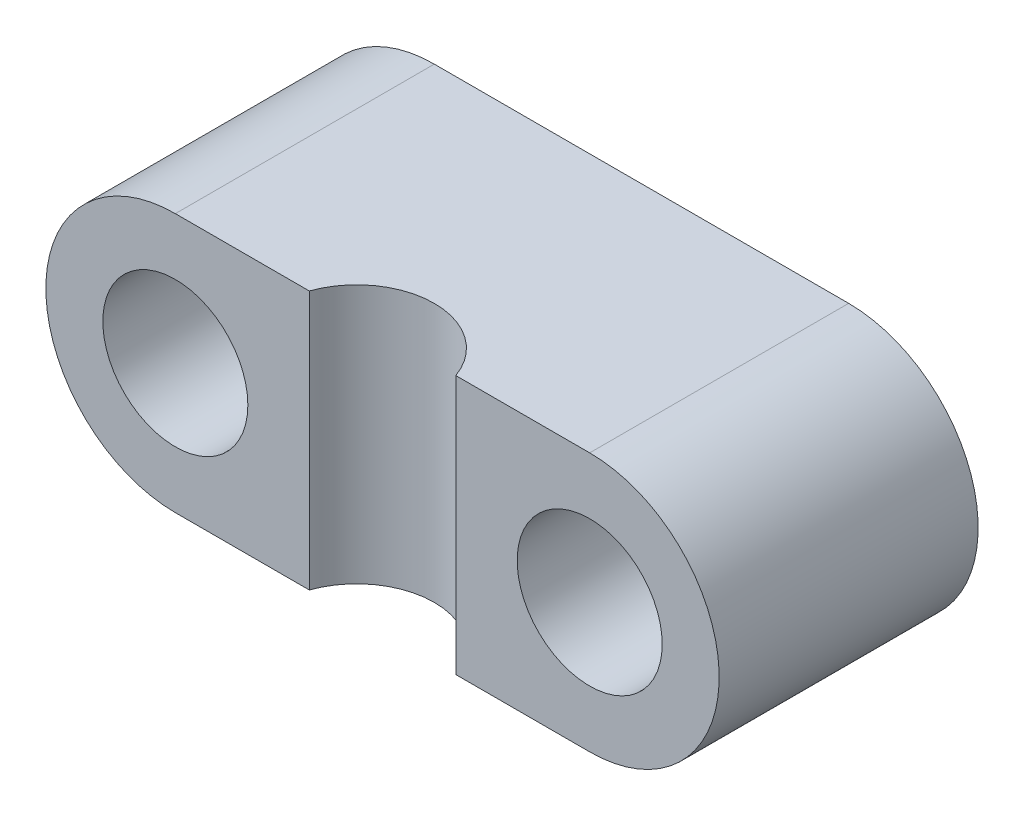
ISO-10303-21;
HEADER;
FILE_DESCRIPTION(('STEP AP214'),'2;1');
FILE_NAME('part.step','',(''),(''),'','','');
FILE_SCHEMA(('AUTOMOTIVE_DESIGN { 1 0 10303 214 1 1 1 1 }'));
ENDSEC;
DATA;
#1=APPLICATION_CONTEXT('core data for automotive mechanical design processes');
#2=APPLICATION_PROTOCOL_DEFINITION('international standard','automotive_design',2000,#1);
#3=PRODUCT_CONTEXT('',#1,'mechanical');
#4=PRODUCT('Part','Part','',(#3));
#5=PRODUCT_RELATED_PRODUCT_CATEGORY('part','',(#4));
#6=PRODUCT_DEFINITION_FORMATION('','',#4);
#7=PRODUCT_DEFINITION_CONTEXT('part definition',#1,'design');
#8=PRODUCT_DEFINITION('design','',#6,#7);
#9=PRODUCT_DEFINITION_SHAPE('','',#8);
#10=(LENGTH_UNIT() NAMED_UNIT(*) SI_UNIT(.MILLI.,.METRE.));
#11=(NAMED_UNIT(*) PLANE_ANGLE_UNIT() SI_UNIT($,.RADIAN.));
#12=(NAMED_UNIT(*) SI_UNIT($,.STERADIAN.) SOLID_ANGLE_UNIT());
#13=UNCERTAINTY_MEASURE_WITH_UNIT(LENGTH_MEASURE(1.E-05),#10,'distance_accuracy_value','');
#14=(GEOMETRIC_REPRESENTATION_CONTEXT(3) GLOBAL_UNCERTAINTY_ASSIGNED_CONTEXT((#13)) GLOBAL_UNIT_ASSIGNED_CONTEXT((#10,
#11,#12)) REPRESENTATION_CONTEXT('',''));
#15=CARTESIAN_POINT('',(0.,0.,0.));
#16=DIRECTION('',(0.,0.,1.));
#17=DIRECTION('',(1.,0.,0.));
#18=AXIS2_PLACEMENT_3D('',#15,#16,#17);
#19=CARTESIAN_POINT('',(4.,0.,5.));
#20=DIRECTION('',(0.,0.,-1.));
#21=DIRECTION('',(-1.,0.,0.));
#22=AXIS2_PLACEMENT_3D('',#19,#20,#21);
#23=PLANE('',#22);
#24=CARTESIAN_POINT('',(-4.,0.,5.));
#25=DIRECTION('',(0.,0.,1.));
#26=DIRECTION('',(1.,0.,0.));
#27=AXIS2_PLACEMENT_3D('',#24,#25,#26);
#28=CIRCLE('',#27,1.4);
#29=CARTESIAN_POINT('',(-2.6,0.,5.));
#30=VERTEX_POINT('',#29);
#31=EDGE_CURVE('E118',#30,#30,#28,.T.);
#32=ORIENTED_EDGE('',*,*,#31,.F.);
#33=EDGE_LOOP('',(#32));
#34=FACE_BOUND('',#33,.T.);
#35=DIRECTION('',(1.,0.,0.));
#36=VECTOR('',#35,1.);
#37=CARTESIAN_POINT('',(-4.,-2.5,5.));
#38=LINE('',#37,#36);
#39=CARTESIAN_POINT('',(-4.,-2.5,5.));
#40=VERTEX_POINT('',#39);
#41=CARTESIAN_POINT('',(-1.4142135623731,-2.5,5.));
#42=VERTEX_POINT('',#41);
#43=EDGE_CURVE('E108',#40,#42,#38,.T.);
#44=ORIENTED_EDGE('',*,*,#43,.T.);
#45=DIRECTION('',(0.,1.,0.));
#46=VECTOR('',#45,1.);
#47=CARTESIAN_POINT('',(-1.4142135623731,-2.5,5.));
#48=LINE('',#47,#46);
#49=CARTESIAN_POINT('',(-1.4142135623731,2.5,5.));
#50=VERTEX_POINT('',#49);
#51=EDGE_CURVE('E49',#42,#50,#48,.T.);
#52=ORIENTED_EDGE('',*,*,#51,.T.);
#53=DIRECTION('',(-1.,0.,0.));
#54=VECTOR('',#53,1.);
#55=CARTESIAN_POINT('',(-4.,2.5,5.));
#56=LINE('',#55,#54);
#57=CARTESIAN_POINT('',(-4.,2.5,5.));
#58=VERTEX_POINT('',#57);
#59=EDGE_CURVE('E140',#50,#58,#56,.T.);
#60=ORIENTED_EDGE('',*,*,#59,.T.);
#61=CARTESIAN_POINT('',(-4.,0.,5.));
#62=DIRECTION('',(0.,0.,1.));
#63=DIRECTION('',(1.,0.,0.));
#64=AXIS2_PLACEMENT_3D('',#61,#62,#63);
#65=CIRCLE('',#64,2.5);
#66=EDGE_CURVE('E109',#58,#40,#65,.T.);
#67=ORIENTED_EDGE('',*,*,#66,.T.);
#68=EDGE_LOOP('',(#44,#52,#60,#67));
#69=FACE_BOUND('',#68,.T.);
#70=ADVANCED_FACE('F34',(#34,#69),#23,.F.);
#71=CARTESIAN_POINT('',(4.,2.5,5.));
#72=VERTEX_POINT('',#71);
#73=CARTESIAN_POINT('',(1.4142135623731,2.5,5.));
#74=VERTEX_POINT('',#73);
#75=EDGE_CURVE('E87',#72,#74,#56,.T.);
#76=ORIENTED_EDGE('',*,*,#75,.T.);
#77=DIRECTION('',(0.,1.,0.));
#78=VECTOR('',#77,1.);
#79=CARTESIAN_POINT('',(1.4142135623731,-2.5,5.));
#80=LINE('',#79,#78);
#81=CARTESIAN_POINT('',(1.4142135623731,-2.5,5.));
#82=VERTEX_POINT('',#81);
#83=EDGE_CURVE('E97',#74,#82,#80,.F.);
#84=ORIENTED_EDGE('',*,*,#83,.T.);
#85=CARTESIAN_POINT('',(4.,-2.5,5.));
#86=VERTEX_POINT('',#85);
#87=EDGE_CURVE('E58',#82,#86,#38,.T.);
#88=ORIENTED_EDGE('',*,*,#87,.T.);
#89=CARTESIAN_POINT('',(4.,0.,5.));
#90=DIRECTION('',(0.,0.,1.));
#91=DIRECTION('',(-1.,0.,0.));
#92=AXIS2_PLACEMENT_3D('',#89,#90,#91);
#93=CIRCLE('',#92,2.5);
#94=EDGE_CURVE('E123',#86,#72,#93,.T.);
#95=ORIENTED_EDGE('',*,*,#94,.T.);
#96=EDGE_LOOP('',(#76,#84,#88,#95));
#97=FACE_BOUND('',#96,.T.);
#98=CARTESIAN_POINT('',(4.,0.,5.));
#99=DIRECTION('',(0.,0.,1.));
#100=DIRECTION('',(1.,0.,0.));
#101=AXIS2_PLACEMENT_3D('',#98,#99,#100);
#102=CIRCLE('',#101,1.4);
#103=CARTESIAN_POINT('',(5.4,0.,5.));
#104=VERTEX_POINT('',#103);
#105=EDGE_CURVE('E146',#104,#104,#102,.T.);
#106=ORIENTED_EDGE('',*,*,#105,.F.);
#107=EDGE_LOOP('',(#106));
#108=FACE_BOUND('',#107,.T.);
#109=ADVANCED_FACE('F102',(#97,#108),#23,.F.);
#110=CARTESIAN_POINT('',(4.,0.,0.));
#111=DIRECTION('',(0.,0.,-1.));
#112=DIRECTION('',(-1.,0.,0.));
#113=AXIS2_PLACEMENT_3D('',#110,#111,#112);
#114=PLANE('',#113);
#115=CARTESIAN_POINT('',(-4.,0.,0.));
#116=DIRECTION('',(0.,0.,1.));
#117=DIRECTION('',(1.,0.,0.));
#118=AXIS2_PLACEMENT_3D('',#115,#116,#117);
#119=CIRCLE('',#118,1.4);
#120=CARTESIAN_POINT('',(-2.6,0.,0.));
#121=VERTEX_POINT('',#120);
#122=EDGE_CURVE('E143',#121,#121,#119,.T.);
#123=ORIENTED_EDGE('',*,*,#122,.T.);
#124=EDGE_LOOP('',(#123));
#125=FACE_BOUND('',#124,.T.);
#126=CARTESIAN_POINT('',(4.,0.,0.));
#127=DIRECTION('',(0.,0.,1.));
#128=DIRECTION('',(-1.,0.,0.));
#129=AXIS2_PLACEMENT_3D('',#126,#127,#128);
#130=CIRCLE('',#129,2.5);
#131=CARTESIAN_POINT('',(4.,-2.5,0.));
#132=VERTEX_POINT('',#131);
#133=CARTESIAN_POINT('',(4.,2.5,0.));
#134=VERTEX_POINT('',#133);
#135=EDGE_CURVE('E114',#132,#134,#130,.T.);
#136=ORIENTED_EDGE('',*,*,#135,.F.);
#137=DIRECTION('',(1.,0.,0.));
#138=VECTOR('',#137,1.);
#139=CARTESIAN_POINT('',(-4.,-2.5,0.));
#140=LINE('',#139,#138);
#141=CARTESIAN_POINT('',(-4.,-2.5,0.));
#142=VERTEX_POINT('',#141);
#143=EDGE_CURVE('E80',#142,#132,#140,.T.);
#144=ORIENTED_EDGE('',*,*,#143,.F.);
#145=CARTESIAN_POINT('',(-4.,0.,0.));
#146=DIRECTION('',(0.,0.,1.));
#147=DIRECTION('',(1.,0.,0.));
#148=AXIS2_PLACEMENT_3D('',#145,#146,#147);
#149=CIRCLE('',#148,2.5);
#150=CARTESIAN_POINT('',(-4.,2.5,0.));
#151=VERTEX_POINT('',#150);
#152=EDGE_CURVE('E120',#151,#142,#149,.T.);
#153=ORIENTED_EDGE('',*,*,#152,.F.);
#154=DIRECTION('',(-1.,0.,0.));
#155=VECTOR('',#154,1.);
#156=CARTESIAN_POINT('',(-4.,2.5,0.));
#157=LINE('',#156,#155);
#158=EDGE_CURVE('E117',#134,#151,#157,.T.);
#159=ORIENTED_EDGE('',*,*,#158,.F.);
#160=EDGE_LOOP('',(#136,#144,#153,#159));
#161=FACE_BOUND('',#160,.T.);
#162=CARTESIAN_POINT('',(4.,0.,0.));
#163=DIRECTION('',(0.,0.,1.));
#164=DIRECTION('',(1.,0.,0.));
#165=AXIS2_PLACEMENT_3D('',#162,#163,#164);
#166=CIRCLE('',#165,1.4);
#167=CARTESIAN_POINT('',(5.4,0.,0.));
#168=VERTEX_POINT('',#167);
#169=EDGE_CURVE('E149',#168,#168,#166,.T.);
#170=ORIENTED_EDGE('',*,*,#169,.T.);
#171=EDGE_LOOP('',(#170));
#172=FACE_BOUND('',#171,.T.);
#173=ADVANCED_FACE('F136',(#125,#161,#172),#114,.T.);
#174=CARTESIAN_POINT('',(4.,0.,5.));
#175=DIRECTION('',(0.,0.,-1.));
#176=DIRECTION('',(-1.,0.,0.));
#177=AXIS2_PLACEMENT_3D('',#174,#175,#176);
#178=CYLINDRICAL_SURFACE('',#177,2.5);
#179=ORIENTED_EDGE('',*,*,#135,.T.);
#180=DIRECTION('',(0.,0.,-1.));
#181=VECTOR('',#180,1.);
#182=CARTESIAN_POINT('',(4.,2.5,5.));
#183=LINE('',#182,#181);
#184=EDGE_CURVE('E11',#72,#134,#183,.T.);
#185=ORIENTED_EDGE('',*,*,#184,.F.);
#186=ORIENTED_EDGE('',*,*,#94,.F.);
#187=DIRECTION('',(0.,0.,-1.));
#188=VECTOR('',#187,1.);
#189=CARTESIAN_POINT('',(4.,-2.5,5.));
#190=LINE('',#189,#188);
#191=EDGE_CURVE('E106',#86,#132,#190,.T.);
#192=ORIENTED_EDGE('',*,*,#191,.T.);
#193=EDGE_LOOP('',(#179,#185,#186,#192));
#194=FACE_BOUND('',#193,.T.);
#195=ADVANCED_FACE('F36',(#194),#178,.T.);
#196=CARTESIAN_POINT('',(-4.,2.5,5.));
#197=DIRECTION('',(0.,-1.,0.));
#198=DIRECTION('',(1.,0.,0.));
#199=AXIS2_PLACEMENT_3D('',#196,#197,#198);
#200=PLANE('',#199);
#201=ORIENTED_EDGE('',*,*,#59,.F.);
#202=CARTESIAN_POINT('',(0.,2.5,5.5));
#203=DIRECTION('',(0.,1.,0.));
#204=DIRECTION('',(0.,0.,1.));
#205=AXIS2_PLACEMENT_3D('',#202,#203,#204);
#206=CIRCLE('',#205,1.5);
#207=EDGE_CURVE('E100',#74,#50,#206,.T.);
#208=ORIENTED_EDGE('',*,*,#207,.F.);
#209=ORIENTED_EDGE('',*,*,#75,.F.);
#210=ORIENTED_EDGE('',*,*,#184,.T.);
#211=ORIENTED_EDGE('',*,*,#158,.T.);
#212=DIRECTION('',(0.,0.,-1.));
#213=VECTOR('',#212,1.);
#214=CARTESIAN_POINT('',(-4.,2.5,5.));
#215=LINE('',#214,#213);
#216=EDGE_CURVE('E42',#58,#151,#215,.T.);
#217=ORIENTED_EDGE('',*,*,#216,.F.);
#218=EDGE_LOOP('',(#201,#208,#209,#210,#211,#217));
#219=FACE_BOUND('',#218,.T.);
#220=ADVANCED_FACE('F156',(#219),#200,.F.);
#221=CARTESIAN_POINT('',(-4.,0.,5.));
#222=DIRECTION('',(0.,0.,-1.));
#223=DIRECTION('',(-1.,0.,0.));
#224=AXIS2_PLACEMENT_3D('',#221,#222,#223);
#225=CYLINDRICAL_SURFACE('',#224,2.5);
#226=ORIENTED_EDGE('',*,*,#152,.T.);
#227=DIRECTION('',(0.,0.,-1.));
#228=VECTOR('',#227,1.);
#229=CARTESIAN_POINT('',(-4.,-2.5,5.));
#230=LINE('',#229,#228);
#231=EDGE_CURVE('E125',#40,#142,#230,.T.);
#232=ORIENTED_EDGE('',*,*,#231,.F.);
#233=ORIENTED_EDGE('',*,*,#66,.F.);
#234=ORIENTED_EDGE('',*,*,#216,.T.);
#235=EDGE_LOOP('',(#226,#232,#233,#234));
#236=FACE_BOUND('',#235,.T.);
#237=ADVANCED_FACE('F131',(#236),#225,.T.);
#238=CARTESIAN_POINT('',(-4.,-2.5,5.));
#239=DIRECTION('',(0.,1.,0.));
#240=DIRECTION('',(-1.,0.,0.));
#241=AXIS2_PLACEMENT_3D('',#238,#239,#240);
#242=PLANE('',#241);
#243=ORIENTED_EDGE('',*,*,#87,.F.);
#244=CARTESIAN_POINT('',(0.,-2.5,5.5));
#245=DIRECTION('',(0.,1.,0.));
#246=DIRECTION('',(0.,0.,1.));
#247=AXIS2_PLACEMENT_3D('',#244,#245,#246);
#248=CIRCLE('',#247,1.5);
#249=EDGE_CURVE('E95',#82,#42,#248,.T.);
#250=ORIENTED_EDGE('',*,*,#249,.T.);
#251=ORIENTED_EDGE('',*,*,#43,.F.);
#252=ORIENTED_EDGE('',*,*,#231,.T.);
#253=ORIENTED_EDGE('',*,*,#143,.T.);
#254=ORIENTED_EDGE('',*,*,#191,.F.);
#255=EDGE_LOOP('',(#243,#250,#251,#252,#253,#254));
#256=FACE_BOUND('',#255,.T.);
#257=ADVANCED_FACE('F105',(#256),#242,.F.);
#258=CARTESIAN_POINT('',(-4.,0.,5.));
#259=DIRECTION('',(0.,0.,-1.));
#260=DIRECTION('',(-1.,0.,0.));
#261=AXIS2_PLACEMENT_3D('',#258,#259,#260);
#262=CYLINDRICAL_SURFACE('',#261,1.4);
#263=ORIENTED_EDGE('',*,*,#31,.T.);
#264=EDGE_LOOP('',(#263));
#265=FACE_BOUND('',#264,.T.);
#266=ORIENTED_EDGE('',*,*,#122,.F.);
#267=EDGE_LOOP('',(#266));
#268=FACE_BOUND('',#267,.T.);
#269=ADVANCED_FACE('F172',(#265,#268),#262,.F.);
#270=CARTESIAN_POINT('',(4.,0.,5.));
#271=DIRECTION('',(0.,0.,-1.));
#272=DIRECTION('',(-1.,0.,0.));
#273=AXIS2_PLACEMENT_3D('',#270,#271,#272);
#274=CYLINDRICAL_SURFACE('',#273,1.4);
#275=ORIENTED_EDGE('',*,*,#105,.T.);
#276=EDGE_LOOP('',(#275));
#277=FACE_BOUND('',#276,.T.);
#278=ORIENTED_EDGE('',*,*,#169,.F.);
#279=EDGE_LOOP('',(#278));
#280=FACE_BOUND('',#279,.T.);
#281=ADVANCED_FACE('F181',(#277,#280),#274,.F.);
#282=CARTESIAN_POINT('',(0.,-2.5,5.5));
#283=DIRECTION('',(0.,1.,0.));
#284=DIRECTION('',(0.,0.,1.));
#285=AXIS2_PLACEMENT_3D('',#282,#283,#284);
#286=CYLINDRICAL_SURFACE('',#285,1.5);
#287=ORIENTED_EDGE('',*,*,#249,.F.);
#288=ORIENTED_EDGE('',*,*,#83,.F.);
#289=ORIENTED_EDGE('',*,*,#207,.T.);
#290=ORIENTED_EDGE('',*,*,#51,.F.);
#291=EDGE_LOOP('',(#287,#288,#289,#290));
#292=FACE_BOUND('',#291,.T.);
#293=ADVANCED_FACE('F96',(#292),#286,.F.);
#294=CLOSED_SHELL('',(#70,#109,#173,#195,#220,#237,#257,#269,#281,#293));
#295=MANIFOLD_SOLID_BREP('B2',#294);
#296=ADVANCED_BREP_SHAPE_REPRESENTATION('',(#18,#295),#14);
#297=SHAPE_DEFINITION_REPRESENTATION(#9,#296);
ENDSEC;
END-ISO-10303-21;
